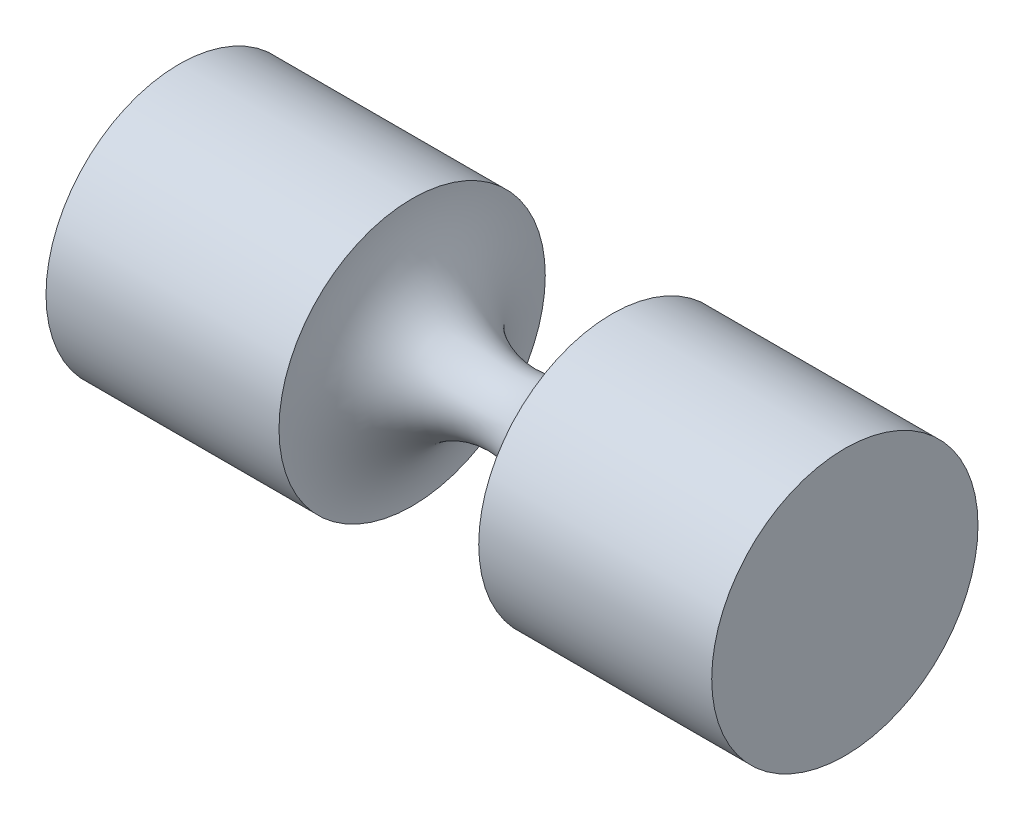
ISO-10303-21;
HEADER;
FILE_DESCRIPTION(('STEP AP214'),'2;1');
FILE_NAME('part.step','',(''),(''),'','','');
FILE_SCHEMA(('AUTOMOTIVE_DESIGN { 1 0 10303 214 1 1 1 1 }'));
ENDSEC;
DATA;
#1=APPLICATION_CONTEXT('core data for automotive mechanical design processes');
#2=APPLICATION_PROTOCOL_DEFINITION('international standard','automotive_design',2000,#1);
#3=PRODUCT_CONTEXT('',#1,'mechanical');
#4=PRODUCT('Part','Part','',(#3));
#5=PRODUCT_RELATED_PRODUCT_CATEGORY('part','',(#4));
#6=PRODUCT_DEFINITION_FORMATION('','',#4);
#7=PRODUCT_DEFINITION_CONTEXT('part definition',#1,'design');
#8=PRODUCT_DEFINITION('design','',#6,#7);
#9=PRODUCT_DEFINITION_SHAPE('','',#8);
#10=(LENGTH_UNIT() NAMED_UNIT(*) SI_UNIT(.MILLI.,.METRE.));
#11=(NAMED_UNIT(*) PLANE_ANGLE_UNIT() SI_UNIT($,.RADIAN.));
#12=(NAMED_UNIT(*) SI_UNIT($,.STERADIAN.) SOLID_ANGLE_UNIT());
#13=UNCERTAINTY_MEASURE_WITH_UNIT(LENGTH_MEASURE(1.E-05),#10,'distance_accuracy_value','');
#14=(GEOMETRIC_REPRESENTATION_CONTEXT(3) GLOBAL_UNCERTAINTY_ASSIGNED_CONTEXT((#13)) GLOBAL_UNIT_ASSIGNED_CONTEXT((#10,
#11,#12)) REPRESENTATION_CONTEXT('',''));
#15=CARTESIAN_POINT('',(0.,0.,0.));
#16=DIRECTION('',(0.,0.,1.));
#17=DIRECTION('',(1.,0.,0.));
#18=AXIS2_PLACEMENT_3D('',#15,#16,#17);
#19=CARTESIAN_POINT('',(200.,0.,-40.));
#20=DIRECTION('',(1.,0.,0.));
#21=DIRECTION('',(0.,0.,-1.));
#22=AXIS2_PLACEMENT_3D('',#19,#20,#21);
#23=PLANE('',#22);
#24=CARTESIAN_POINT('',(200.,0.,0.));
#25=DIRECTION('',(1.,0.,0.));
#26=DIRECTION('',(0.,0.,-1.));
#27=AXIS2_PLACEMENT_3D('',#24,#25,#26);
#28=CIRCLE('',#27,40.);
#29=CARTESIAN_POINT('',(200.,0.,-40.));
#30=VERTEX_POINT('',#29);
#31=EDGE_CURVE('E10',#30,#30,#28,.T.);
#32=ORIENTED_EDGE('',*,*,#31,.T.);
#33=EDGE_LOOP('',(#32));
#34=FACE_BOUND('',#33,.T.);
#35=ADVANCED_FACE('F35',(#34),#23,.T.);
#36=CARTESIAN_POINT('',(200.,0.,0.));
#37=DIRECTION('',(1.,0.,0.));
#38=DIRECTION('',(0.,0.,-1.));
#39=AXIS2_PLACEMENT_3D('',#36,#37,#38);
#40=CYLINDRICAL_SURFACE('',#39,40.);
#41=CARTESIAN_POINT('',(130.,0.,0.));
#42=DIRECTION('',(1.,0.,0.));
#43=DIRECTION('',(0.,0.,-1.));
#44=AXIS2_PLACEMENT_3D('',#41,#42,#43);
#45=CIRCLE('',#44,40.);
#46=CARTESIAN_POINT('',(130.,0.,-40.));
#47=VERTEX_POINT('',#46);
#48=EDGE_CURVE('E41',#47,#47,#45,.T.);
#49=ORIENTED_EDGE('',*,*,#48,.T.);
#50=EDGE_LOOP('',(#49));
#51=FACE_BOUND('',#50,.T.);
#52=ORIENTED_EDGE('',*,*,#31,.F.);
#53=EDGE_LOOP('',(#52));
#54=FACE_BOUND('',#53,.T.);
#55=ADVANCED_FACE('F67',(#51,#54),#40,.T.);
#56=CARTESIAN_POINT('',(100.,0.,0.));
#57=DIRECTION('',(1.,0.,0.));
#58=DIRECTION('',(0.,0.,-1.));
#59=AXIS2_PLACEMENT_3D('',#56,#57,#58);
#60=TOROIDAL_SURFACE('',#59,40.,30.);
#61=CARTESIAN_POINT('',(70.,0.,0.));
#62=DIRECTION('',(1.,0.,0.));
#63=DIRECTION('',(0.,0.,-1.));
#64=AXIS2_PLACEMENT_3D('',#61,#62,#63);
#65=CIRCLE('',#64,40.);
#66=CARTESIAN_POINT('',(70.,0.,-40.));
#67=VERTEX_POINT('',#66);
#68=EDGE_CURVE('E45',#67,#67,#65,.T.);
#69=ORIENTED_EDGE('',*,*,#68,.T.);
#70=EDGE_LOOP('',(#69));
#71=FACE_BOUND('',#70,.T.);
#72=ORIENTED_EDGE('',*,*,#48,.F.);
#73=EDGE_LOOP('',(#72));
#74=FACE_BOUND('',#73,.T.);
#75=ADVANCED_FACE('F64',(#71,#74),#60,.F.);
#76=CARTESIAN_POINT('',(200.,0.,0.));
#77=DIRECTION('',(1.,0.,0.));
#78=DIRECTION('',(0.,0.,-1.));
#79=AXIS2_PLACEMENT_3D('',#76,#77,#78);
#80=CYLINDRICAL_SURFACE('',#79,40.);
#81=CARTESIAN_POINT('',(0.,0.,0.));
#82=DIRECTION('',(1.,0.,0.));
#83=DIRECTION('',(0.,0.,-1.));
#84=AXIS2_PLACEMENT_3D('',#81,#82,#83);
#85=CIRCLE('',#84,40.);
#86=CARTESIAN_POINT('',(0.,0.,-40.));
#87=VERTEX_POINT('',#86);
#88=EDGE_CURVE('E49',#87,#87,#85,.T.);
#89=ORIENTED_EDGE('',*,*,#88,.T.);
#90=EDGE_LOOP('',(#89));
#91=FACE_BOUND('',#90,.T.);
#92=ORIENTED_EDGE('',*,*,#68,.F.);
#93=EDGE_LOOP('',(#92));
#94=FACE_BOUND('',#93,.T.);
#95=ADVANCED_FACE('F55',(#91,#94),#80,.T.);
#96=CARTESIAN_POINT('',(0.,0.,0.));
#97=DIRECTION('',(-1.,0.,0.));
#98=DIRECTION('',(0.,0.,1.));
#99=AXIS2_PLACEMENT_3D('',#96,#97,#98);
#100=PLANE('',#99);
#101=ORIENTED_EDGE('',*,*,#88,.F.);
#102=EDGE_LOOP('',(#101));
#103=FACE_BOUND('',#102,.T.);
#104=ADVANCED_FACE('F58',(#103),#100,.T.);
#105=CLOSED_SHELL('',(#35,#55,#75,#95,#104));
#106=MANIFOLD_SOLID_BREP('B2',#105);
#107=ADVANCED_BREP_SHAPE_REPRESENTATION('',(#18,#106),#14);
#108=SHAPE_DEFINITION_REPRESENTATION(#9,#107);
ENDSEC;
END-ISO-10303-21;
